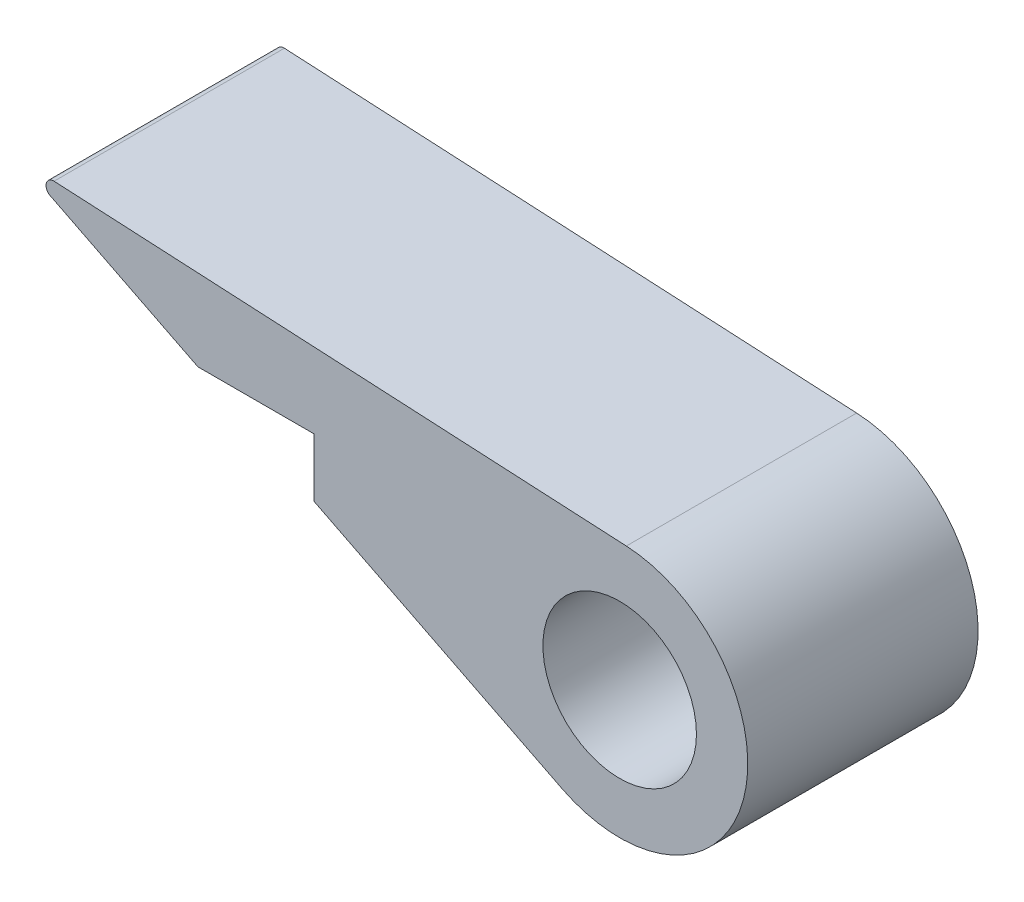
ISO-10303-21;
HEADER;
FILE_DESCRIPTION(('STEP AP214'),'2;1');
FILE_NAME('part.step','',(''),(''),'','','');
FILE_SCHEMA(('AUTOMOTIVE_DESIGN { 1 0 10303 214 1 1 1 1 }'));
ENDSEC;
DATA;
#1=APPLICATION_CONTEXT('core data for automotive mechanical design processes');
#2=APPLICATION_PROTOCOL_DEFINITION('international standard','automotive_design',2000,#1);
#3=PRODUCT_CONTEXT('',#1,'mechanical');
#4=PRODUCT('Part','Part','',(#3));
#5=PRODUCT_RELATED_PRODUCT_CATEGORY('part','',(#4));
#6=PRODUCT_DEFINITION_FORMATION('','',#4);
#7=PRODUCT_DEFINITION_CONTEXT('part definition',#1,'design');
#8=PRODUCT_DEFINITION('design','',#6,#7);
#9=PRODUCT_DEFINITION_SHAPE('','',#8);
#10=(LENGTH_UNIT() NAMED_UNIT(*) SI_UNIT(.MILLI.,.METRE.));
#11=(NAMED_UNIT(*) PLANE_ANGLE_UNIT() SI_UNIT($,.RADIAN.));
#12=(NAMED_UNIT(*) SI_UNIT($,.STERADIAN.) SOLID_ANGLE_UNIT());
#13=UNCERTAINTY_MEASURE_WITH_UNIT(LENGTH_MEASURE(1.E-05),#10,'distance_accuracy_value','');
#14=(GEOMETRIC_REPRESENTATION_CONTEXT(3) GLOBAL_UNCERTAINTY_ASSIGNED_CONTEXT((#13)) GLOBAL_UNIT_ASSIGNED_CONTEXT((#10,
#11,#12)) REPRESENTATION_CONTEXT('',''));
#15=CARTESIAN_POINT('',(0.,0.,0.));
#16=DIRECTION('',(0.,0.,1.));
#17=DIRECTION('',(1.,0.,0.));
#18=AXIS2_PLACEMENT_3D('',#15,#16,#17);
#19=CARTESIAN_POINT('',(7.38396510784134,9.00978006073871,13.2221611589701));
#20=DIRECTION('',(-0.449561500243912,-0.893249381471067,0.));
#21=DIRECTION('',(0.893249381471067,-0.449561500243912,0.));
#22=AXIS2_PLACEMENT_3D('',#19,#20,#21);
#23=PLANE('',#22);
#24=DIRECTION('',(0.,0.,1.));
#25=VECTOR('',#24,1.);
#26=CARTESIAN_POINT('',(4.15117477372548,10.6368039386458,13.2221611589701));
#27=LINE('',#26,#25);
#28=CARTESIAN_POINT('',(4.15117477372548,10.6368039386458,0.));
#29=VERTEX_POINT('',#28);
#30=CARTESIAN_POINT('',(4.15117477372548,10.6368039386458,3.));
#31=VERTEX_POINT('',#30);
#32=EDGE_CURVE('E11',#29,#31,#27,.T.);
#33=ORIENTED_EDGE('',*,*,#32,.F.);
#34=DIRECTION('',(-0.893249381471067,0.449561500243912,0.));
#35=VECTOR('',#34,1.);
#36=CARTESIAN_POINT('',(7.38396510784134,9.00978006073871,0.));
#37=LINE('',#36,#35);
#38=CARTESIAN_POINT('',(7.38396510784134,9.00978006073871,0.));
#39=VERTEX_POINT('',#38);
#40=EDGE_CURVE('E110',#39,#29,#37,.T.);
#41=ORIENTED_EDGE('',*,*,#40,.F.);
#42=DIRECTION('',(0.,0.,-1.));
#43=VECTOR('',#42,1.);
#44=CARTESIAN_POINT('',(7.38396510784134,9.00978006073871,13.2221611589701));
#45=LINE('',#44,#43);
#46=CARTESIAN_POINT('',(7.38396510784134,9.00978006073871,3.));
#47=VERTEX_POINT('',#46);
#48=EDGE_CURVE('E115',#47,#39,#45,.T.);
#49=ORIENTED_EDGE('',*,*,#48,.F.);
#50=DIRECTION('',(-0.893249381471067,0.449561500243912,0.));
#51=VECTOR('',#50,1.);
#52=CARTESIAN_POINT('',(7.38396510784134,9.00978006073871,3.));
#53=LINE('',#52,#51);
#54=EDGE_CURVE('E121',#47,#31,#53,.T.);
#55=ORIENTED_EDGE('',*,*,#54,.T.);
#56=EDGE_LOOP('',(#33,#41,#49,#55));
#57=FACE_BOUND('',#56,.T.);
#58=ADVANCED_FACE('F32',(#57),#23,.T.);
#59=CARTESIAN_POINT('',(8.13397459621556,10.5,7.71870295740113));
#60=DIRECTION('',(0.,0.,-1.));
#61=DIRECTION('',(-1.,0.,0.));
#62=AXIS2_PLACEMENT_3D('',#59,#60,#61);
#63=CYLINDRICAL_SURFACE('',#62,1.66831342979168);
#64=CARTESIAN_POINT('',(8.13397459621556,10.5,0.));
#65=DIRECTION('',(0.,0.,-1.));
#66=DIRECTION('',(-1.,0.,0.));
#67=AXIS2_PLACEMENT_3D('',#64,#65,#66);
#68=CIRCLE('',#67,1.66831342979168);
#69=CARTESIAN_POINT('',(8.22077946617229,12.1660536049525,0.));
#70=VERTEX_POINT('',#69);
#71=EDGE_CURVE('E131',#70,#39,#68,.T.);
#72=ORIENTED_EDGE('',*,*,#71,.F.);
#73=DIRECTION('',(0.,0.,-1.));
#74=VECTOR('',#73,1.);
#75=CARTESIAN_POINT('',(8.22077946617229,12.1660536049525,13.2221611589701));
#76=LINE('',#75,#74);
#77=CARTESIAN_POINT('',(8.22077946617229,12.1660536049525,3.));
#78=VERTEX_POINT('',#77);
#79=EDGE_CURVE('E127',#78,#70,#76,.T.);
#80=ORIENTED_EDGE('',*,*,#79,.F.);
#81=CARTESIAN_POINT('',(8.13397459621556,10.5,3.));
#82=DIRECTION('',(0.,0.,1.));
#83=DIRECTION('',(1.,0.,0.));
#84=AXIS2_PLACEMENT_3D('',#81,#82,#83);
#85=CIRCLE('',#84,1.66831342979168);
#86=EDGE_CURVE('E118',#78,#47,#85,.F.);
#87=ORIENTED_EDGE('',*,*,#86,.T.);
#88=ORIENTED_EDGE('',*,*,#48,.T.);
#89=EDGE_LOOP('',(#72,#80,#87,#88));
#90=FACE_BOUND('',#89,.T.);
#91=ADVANCED_FACE('F163',(#90),#63,.T.);
#92=CARTESIAN_POINT('',(0.,0.,3.));
#93=DIRECTION('',(0.,0.,1.));
#94=DIRECTION('',(1.,0.,0.));
#95=AXIS2_PLACEMENT_3D('',#92,#93,#94);
#96=PLANE('',#95);
#97=DIRECTION('',(0.,1.,0.));
#98=VECTOR('',#97,1.);
#99=CARTESIAN_POINT('',(4.15117477372548,0.,3.));
#100=LINE('',#99,#98);
#101=CARTESIAN_POINT('',(4.15117477372548,11.3970580756228,3.00000000000001));
#102=VERTEX_POINT('',#101);
#103=EDGE_CURVE('E97',#31,#102,#100,.T.);
#104=ORIENTED_EDGE('',*,*,#103,.F.);
#105=ORIENTED_EDGE('',*,*,#54,.F.);
#106=ORIENTED_EDGE('',*,*,#86,.F.);
#107=DIRECTION('',(0.998645443476705,-0.0520315118290319,0.));
#108=VECTOR('',#107,1.);
#109=CARTESIAN_POINT('',(0.291822443675773,12.5791688139616,3.));
#110=LINE('',#109,#108);
#111=CARTESIAN_POINT('',(0.76709027290416,12.5544063681506,3.));
#112=VERTEX_POINT('',#111);
#113=EDGE_CURVE('E125',#112,#78,#110,.T.);
#114=ORIENTED_EDGE('',*,*,#113,.F.);
#115=CARTESIAN_POINT('',(0.761887121721256,12.454541823803,3.));
#116=DIRECTION('',(0.,0.,1.));
#117=DIRECTION('',(1.,0.,0.));
#118=AXIS2_PLACEMENT_3D('',#115,#116,#117);
#119=CIRCLE('',#118,0.1);
#120=CARTESIAN_POINT('',(0.716930971696864,12.3652168856559,3.));
#121=VERTEX_POINT('',#120);
#122=EDGE_CURVE('E146',#112,#121,#119,.T.);
#123=ORIENTED_EDGE('',*,*,#122,.T.);
#124=CARTESIAN_POINT('',(2.64059938582611,11.3970580756228,3.));
#125=VERTEX_POINT('',#124);
#126=EDGE_CURVE('E124',#125,#121,#53,.T.);
#127=ORIENTED_EDGE('',*,*,#126,.F.);
#128=DIRECTION('',(-1.,0.,0.));
#129=VECTOR('',#128,1.);
#130=CARTESIAN_POINT('',(0.,11.3970580756228,3.));
#131=LINE('',#130,#129);
#132=EDGE_CURVE('E47',#102,#125,#131,.T.);
#133=ORIENTED_EDGE('',*,*,#132,.F.);
#134=EDGE_LOOP('',(#104,#105,#106,#114,#123,#127,#133));
#135=FACE_BOUND('',#134,.T.);
#136=CARTESIAN_POINT('',(8.13397459621556,10.5,3.));
#137=DIRECTION('',(0.,0.,1.));
#138=DIRECTION('',(1.,0.,0.));
#139=AXIS2_PLACEMENT_3D('',#136,#137,#138);
#140=CIRCLE('',#139,1.);
#141=CARTESIAN_POINT('',(9.13397459621556,10.5,3.));
#142=VERTEX_POINT('',#141);
#143=EDGE_CURVE('E137',#142,#142,#140,.T.);
#144=ORIENTED_EDGE('',*,*,#143,.F.);
#145=EDGE_LOOP('',(#144));
#146=FACE_BOUND('',#145,.T.);
#147=ADVANCED_FACE('F152',(#135,#146),#96,.T.);
#148=CARTESIAN_POINT('',(0.,0.,0.));
#149=DIRECTION('',(0.,0.,1.));
#150=DIRECTION('',(1.,0.,0.));
#151=AXIS2_PLACEMENT_3D('',#148,#149,#150);
#152=PLANE('',#151);
#153=ORIENTED_EDGE('',*,*,#40,.T.);
#154=DIRECTION('',(0.,-1.,0.));
#155=VECTOR('',#154,1.);
#156=CARTESIAN_POINT('',(4.15117477372548,11.3970580756228,0.));
#157=LINE('',#156,#155);
#158=CARTESIAN_POINT('',(4.15117477372548,11.3970580756228,0.));
#159=VERTEX_POINT('',#158);
#160=EDGE_CURVE('E94',#159,#29,#157,.T.);
#161=ORIENTED_EDGE('',*,*,#160,.F.);
#162=DIRECTION('',(1.,0.,0.));
#163=VECTOR('',#162,1.);
#164=CARTESIAN_POINT('',(4.15117477372548,11.3970580756228,0.));
#165=LINE('',#164,#163);
#166=CARTESIAN_POINT('',(2.64059938582611,11.3970580756228,0.));
#167=VERTEX_POINT('',#166);
#168=EDGE_CURVE('E98',#167,#159,#165,.T.);
#169=ORIENTED_EDGE('',*,*,#168,.F.);
#170=CARTESIAN_POINT('',(0.716930971696866,12.3652168856559,0.));
#171=VERTEX_POINT('',#170);
#172=EDGE_CURVE('E120',#167,#171,#37,.T.);
#173=ORIENTED_EDGE('',*,*,#172,.T.);
#174=CARTESIAN_POINT('',(0.761887121721256,12.454541823803,0.));
#175=DIRECTION('',(0.,0.,1.));
#176=DIRECTION('',(1.,0.,0.));
#177=AXIS2_PLACEMENT_3D('',#174,#175,#176);
#178=CIRCLE('',#177,0.1);
#179=CARTESIAN_POINT('',(0.76709027290416,12.5544063681506,0.));
#180=VERTEX_POINT('',#179);
#181=EDGE_CURVE('E143',#171,#180,#178,.F.);
#182=ORIENTED_EDGE('',*,*,#181,.T.);
#183=DIRECTION('',(0.998645443476705,-0.0520315118290319,0.));
#184=VECTOR('',#183,1.);
#185=CARTESIAN_POINT('',(0.291822443675773,12.5791688139616,0.));
#186=LINE('',#185,#184);
#187=EDGE_CURVE('E116',#180,#70,#186,.T.);
#188=ORIENTED_EDGE('',*,*,#187,.T.);
#189=ORIENTED_EDGE('',*,*,#71,.T.);
#190=EDGE_LOOP('',(#153,#161,#169,#173,#182,#188,#189));
#191=FACE_BOUND('',#190,.T.);
#192=CARTESIAN_POINT('',(8.13397459621556,10.5,0.));
#193=DIRECTION('',(0.,0.,1.));
#194=DIRECTION('',(1.,0.,0.));
#195=AXIS2_PLACEMENT_3D('',#192,#193,#194);
#196=CIRCLE('',#195,1.);
#197=CARTESIAN_POINT('',(9.13397459621556,10.5,0.));
#198=VERTEX_POINT('',#197);
#199=EDGE_CURVE('E133',#198,#198,#196,.T.);
#200=ORIENTED_EDGE('',*,*,#199,.T.);
#201=EDGE_LOOP('',(#200));
#202=FACE_BOUND('',#201,.T.);
#203=ADVANCED_FACE('F106',(#191,#202),#152,.F.);
#204=CARTESIAN_POINT('',(8.13397459621556,10.5,3.));
#205=DIRECTION('',(0.,0.,-1.));
#206=DIRECTION('',(-1.,0.,0.));
#207=AXIS2_PLACEMENT_3D('',#204,#205,#206);
#208=CYLINDRICAL_SURFACE('',#207,1.);
#209=ORIENTED_EDGE('',*,*,#143,.T.);
#210=EDGE_LOOP('',(#209));
#211=FACE_BOUND('',#210,.T.);
#212=ORIENTED_EDGE('',*,*,#199,.F.);
#213=EDGE_LOOP('',(#212));
#214=FACE_BOUND('',#213,.T.);
#215=ADVANCED_FACE('F180',(#211,#214),#208,.F.);
#216=CARTESIAN_POINT('',(0.291822443675773,12.5791688139616,13.2221611589701));
#217=DIRECTION('',(0.0520315118290319,0.998645443476705,0.));
#218=DIRECTION('',(-0.998645443476705,0.0520315118290319,0.));
#219=AXIS2_PLACEMENT_3D('',#216,#217,#218);
#220=PLANE('',#219);
#221=ORIENTED_EDGE('',*,*,#187,.F.);
#222=DIRECTION('',(0.,0.,-1.));
#223=VECTOR('',#222,1.);
#224=CARTESIAN_POINT('',(0.76709027290416,12.5544063681506,13.2221611589701));
#225=LINE('',#224,#223);
#226=EDGE_CURVE('E55',#180,#112,#225,.F.);
#227=ORIENTED_EDGE('',*,*,#226,.T.);
#228=ORIENTED_EDGE('',*,*,#113,.T.);
#229=ORIENTED_EDGE('',*,*,#79,.T.);
#230=EDGE_LOOP('',(#221,#227,#228,#229));
#231=FACE_BOUND('',#230,.T.);
#232=ADVANCED_FACE('F160',(#231),#220,.T.);
#233=DIRECTION('',(0.,0.,-1.));
#234=VECTOR('',#233,1.);
#235=CARTESIAN_POINT('',(2.64059938582611,11.3970580756228,13.2221611589701));
#236=LINE('',#235,#234);
#237=EDGE_CURVE('E40',#125,#167,#236,.T.);
#238=ORIENTED_EDGE('',*,*,#237,.F.);
#239=ORIENTED_EDGE('',*,*,#126,.T.);
#240=DIRECTION('',(0.,0.,-1.));
#241=VECTOR('',#240,1.);
#242=CARTESIAN_POINT('',(0.716930971696864,12.3652168856559,13.2221611589701));
#243=LINE('',#242,#241);
#244=EDGE_CURVE('E140',#121,#171,#243,.T.);
#245=ORIENTED_EDGE('',*,*,#244,.T.);
#246=ORIENTED_EDGE('',*,*,#172,.F.);
#247=EDGE_LOOP('',(#238,#239,#245,#246));
#248=FACE_BOUND('',#247,.T.);
#249=ADVANCED_FACE('F158',(#248),#23,.T.);
#250=CARTESIAN_POINT('',(0.761887121721256,12.454541823803,13.2221611589701));
#251=DIRECTION('',(0.,0.,-1.));
#252=DIRECTION('',(-1.,0.,0.));
#253=AXIS2_PLACEMENT_3D('',#250,#251,#252);
#254=CYLINDRICAL_SURFACE('',#253,0.1);
#255=ORIENTED_EDGE('',*,*,#122,.F.);
#256=ORIENTED_EDGE('',*,*,#226,.F.);
#257=ORIENTED_EDGE('',*,*,#181,.F.);
#258=ORIENTED_EDGE('',*,*,#244,.F.);
#259=EDGE_LOOP('',(#255,#256,#257,#258));
#260=FACE_BOUND('',#259,.T.);
#261=ADVANCED_FACE('F34',(#260),#254,.T.);
#262=CARTESIAN_POINT('',(4.15117477372548,11.3970580756228,30.01));
#263=DIRECTION('',(1.,0.,0.));
#264=DIRECTION('',(0.,0.,-1.));
#265=AXIS2_PLACEMENT_3D('',#262,#263,#264);
#266=PLANE('',#265);
#267=ORIENTED_EDGE('',*,*,#103,.T.);
#268=DIRECTION('',(0.,0.,-1.));
#269=VECTOR('',#268,1.);
#270=CARTESIAN_POINT('',(4.15117477372548,11.3970580756228,30.01));
#271=LINE('',#270,#269);
#272=EDGE_CURVE('E90',#102,#159,#271,.T.);
#273=ORIENTED_EDGE('',*,*,#272,.T.);
#274=ORIENTED_EDGE('',*,*,#160,.T.);
#275=ORIENTED_EDGE('',*,*,#32,.T.);
#276=EDGE_LOOP('',(#267,#273,#274,#275));
#277=FACE_BOUND('',#276,.T.);
#278=ADVANCED_FACE('F92',(#277),#266,.F.);
#279=CARTESIAN_POINT('',(4.15117477372548,11.3970580756228,30.01));
#280=DIRECTION('',(0.,1.,0.));
#281=DIRECTION('',(0.,0.,1.));
#282=AXIS2_PLACEMENT_3D('',#279,#280,#281);
#283=PLANE('',#282);
#284=ORIENTED_EDGE('',*,*,#132,.T.);
#285=ORIENTED_EDGE('',*,*,#237,.T.);
#286=ORIENTED_EDGE('',*,*,#168,.T.);
#287=ORIENTED_EDGE('',*,*,#272,.F.);
#288=EDGE_LOOP('',(#284,#285,#286,#287));
#289=FACE_BOUND('',#288,.T.);
#290=ADVANCED_FACE('F101',(#289),#283,.F.);
#291=CLOSED_SHELL('',(#58,#91,#147,#203,#215,#232,#249,#261,#278,#290));
#292=MANIFOLD_SOLID_BREP('B2',#291);
#293=ADVANCED_BREP_SHAPE_REPRESENTATION('',(#18,#292),#14);
#294=SHAPE_DEFINITION_REPRESENTATION(#9,#293);
ENDSEC;
END-ISO-10303-21;
